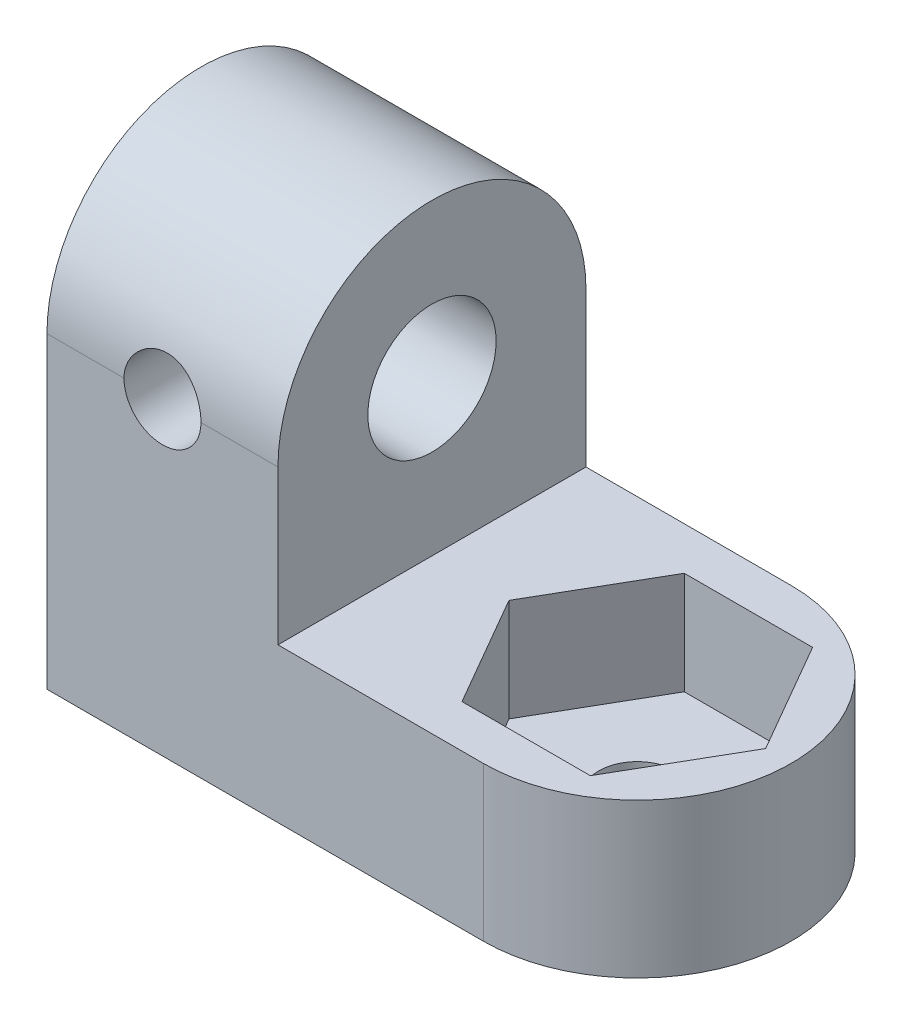
ISO-10303-21;
HEADER;
FILE_DESCRIPTION(('STEP AP214'),'2;1');
FILE_NAME('part.step','',(''),(''),'','','');
FILE_SCHEMA(('AUTOMOTIVE_DESIGN { 1 0 10303 214 1 1 1 1 }'));
ENDSEC;
DATA;
#1=APPLICATION_CONTEXT('core data for automotive mechanical design processes');
#2=APPLICATION_PROTOCOL_DEFINITION('international standard','automotive_design',2000,#1);
#3=PRODUCT_CONTEXT('',#1,'mechanical');
#4=PRODUCT('Part','Part','',(#3));
#5=PRODUCT_RELATED_PRODUCT_CATEGORY('part','',(#4));
#6=PRODUCT_DEFINITION_FORMATION('','',#4);
#7=PRODUCT_DEFINITION_CONTEXT('part definition',#1,'design');
#8=PRODUCT_DEFINITION('design','',#6,#7);
#9=PRODUCT_DEFINITION_SHAPE('','',#8);
#10=(LENGTH_UNIT() NAMED_UNIT(*) SI_UNIT(.MILLI.,.METRE.));
#11=(NAMED_UNIT(*) PLANE_ANGLE_UNIT() SI_UNIT($,.RADIAN.));
#12=(NAMED_UNIT(*) SI_UNIT($,.STERADIAN.) SOLID_ANGLE_UNIT());
#13=UNCERTAINTY_MEASURE_WITH_UNIT(LENGTH_MEASURE(1.E-05),#10,'distance_accuracy_value','');
#14=(GEOMETRIC_REPRESENTATION_CONTEXT(3) GLOBAL_UNCERTAINTY_ASSIGNED_CONTEXT((#13)) GLOBAL_UNIT_ASSIGNED_CONTEXT((#10,
#11,#12)) REPRESENTATION_CONTEXT('',''));
#15=CARTESIAN_POINT('',(0.,0.,0.));
#16=DIRECTION('',(0.,0.,1.));
#17=DIRECTION('',(1.,0.,0.));
#18=AXIS2_PLACEMENT_3D('',#15,#16,#17);
#19=CARTESIAN_POINT('',(-17.,6.,0.));
#20=DIRECTION('',(1.,0.,0.));
#21=DIRECTION('',(0.,0.,-1.));
#22=AXIS2_PLACEMENT_3D('',#19,#20,#21);
#23=PLANE('',#22);
#24=CARTESIAN_POINT('',(-17.,12.,0.));
#25=DIRECTION('',(1.,0.,0.));
#26=DIRECTION('',(0.,0.,-1.));
#27=AXIS2_PLACEMENT_3D('',#24,#25,#26);
#28=CIRCLE('',#27,2.5);
#29=CARTESIAN_POINT('',(-17.,12.,-2.5));
#30=VERTEX_POINT('',#29);
#31=EDGE_CURVE('E398',#30,#30,#28,.T.);
#32=ORIENTED_EDGE('',*,*,#31,.T.);
#33=EDGE_LOOP('',(#32));
#34=FACE_BOUND('',#33,.T.);
#35=DIRECTION('',(0.,-1.,0.));
#36=VECTOR('',#35,1.);
#37=CARTESIAN_POINT('',(-17.,6.,6.));
#38=LINE('',#37,#36);
#39=CARTESIAN_POINT('',(-17.,12.,6.));
#40=VERTEX_POINT('',#39);
#41=CARTESIAN_POINT('',(-17.,0.,6.));
#42=VERTEX_POINT('',#41);
#43=EDGE_CURVE('E273',#40,#42,#38,.T.);
#44=ORIENTED_EDGE('',*,*,#43,.F.);
#45=CARTESIAN_POINT('',(-17.,12.,0.));
#46=DIRECTION('',(-1.,0.,0.));
#47=DIRECTION('',(0.,0.,1.));
#48=AXIS2_PLACEMENT_3D('',#45,#46,#47);
#49=CIRCLE('',#48,6.);
#50=CARTESIAN_POINT('',(-17.,12.,-6.));
#51=VERTEX_POINT('',#50);
#52=EDGE_CURVE('E176',#40,#51,#49,.T.);
#53=ORIENTED_EDGE('',*,*,#52,.T.);
#54=DIRECTION('',(0.,-1.,0.));
#55=VECTOR('',#54,1.);
#56=CARTESIAN_POINT('',(-17.,6.,-6.));
#57=LINE('',#56,#55);
#58=CARTESIAN_POINT('',(-17.,0.,-6.));
#59=VERTEX_POINT('',#58);
#60=EDGE_CURVE('E289',#51,#59,#57,.T.);
#61=ORIENTED_EDGE('',*,*,#60,.T.);
#62=DIRECTION('',(0.,0.,1.));
#63=VECTOR('',#62,1.);
#64=CARTESIAN_POINT('',(-17.,0.,0.));
#65=LINE('',#64,#63);
#66=EDGE_CURVE('E266',#59,#42,#65,.T.);
#67=ORIENTED_EDGE('',*,*,#66,.T.);
#68=EDGE_LOOP('',(#44,#53,#61,#67));
#69=FACE_BOUND('',#68,.T.);
#70=ADVANCED_FACE('F41',(#34,#69),#23,.F.);
#71=CARTESIAN_POINT('',(-8.,18.,6.));
#72=DIRECTION('',(-1.,0.,0.));
#73=DIRECTION('',(0.,0.,1.));
#74=AXIS2_PLACEMENT_3D('',#71,#72,#73);
#75=PLANE('',#74);
#76=CARTESIAN_POINT('',(-8.,12.,0.));
#77=DIRECTION('',(1.,0.,0.));
#78=DIRECTION('',(0.,0.,-1.));
#79=AXIS2_PLACEMENT_3D('',#76,#77,#78);
#80=CIRCLE('',#79,2.5);
#81=CARTESIAN_POINT('',(-8.,12.,-2.5));
#82=VERTEX_POINT('',#81);
#83=EDGE_CURVE('E154',#82,#82,#80,.T.);
#84=ORIENTED_EDGE('',*,*,#83,.F.);
#85=EDGE_LOOP('',(#84));
#86=FACE_BOUND('',#85,.T.);
#87=CARTESIAN_POINT('',(-8.,12.,0.));
#88=DIRECTION('',(-1.,0.,0.));
#89=DIRECTION('',(0.,0.,1.));
#90=AXIS2_PLACEMENT_3D('',#87,#88,#89);
#91=CIRCLE('',#90,6.);
#92=CARTESIAN_POINT('',(-8.,12.,6.));
#93=VERTEX_POINT('',#92);
#94=CARTESIAN_POINT('',(-8.,12.,-6.));
#95=VERTEX_POINT('',#94);
#96=EDGE_CURVE('E169',#93,#95,#91,.T.);
#97=ORIENTED_EDGE('',*,*,#96,.F.);
#98=DIRECTION('',(0.,-1.,0.));
#99=VECTOR('',#98,1.);
#100=CARTESIAN_POINT('',(-8.,18.,6.));
#101=LINE('',#100,#99);
#102=CARTESIAN_POINT('',(-8.,6.,6.));
#103=VERTEX_POINT('',#102);
#104=EDGE_CURVE('E186',#93,#103,#101,.T.);
#105=ORIENTED_EDGE('',*,*,#104,.T.);
#106=DIRECTION('',(0.,0.,-1.));
#107=VECTOR('',#106,1.);
#108=CARTESIAN_POINT('',(-8.,6.,6.));
#109=LINE('',#108,#107);
#110=CARTESIAN_POINT('',(-8.,6.,-6.));
#111=VERTEX_POINT('',#110);
#112=EDGE_CURVE('E174',#103,#111,#109,.T.);
#113=ORIENTED_EDGE('',*,*,#112,.T.);
#114=DIRECTION('',(0.,-1.,0.));
#115=VECTOR('',#114,1.);
#116=CARTESIAN_POINT('',(-8.,18.,-6.));
#117=LINE('',#116,#115);
#118=EDGE_CURVE('E183',#95,#111,#117,.T.);
#119=ORIENTED_EDGE('',*,*,#118,.F.);
#120=EDGE_LOOP('',(#97,#105,#113,#119));
#121=FACE_BOUND('',#120,.T.);
#122=ADVANCED_FACE('F331',(#86,#121),#75,.F.);
#123=CARTESIAN_POINT('',(0.,6.,6.));
#124=DIRECTION('',(0.,0.,1.));
#125=DIRECTION('',(1.,0.,0.));
#126=AXIS2_PLACEMENT_3D('',#123,#124,#125);
#127=PLANE('',#126);
#128=CARTESIAN_POINT('',(-12.5,12.,6.));
#129=DIRECTION('',(0.,0.,1.));
#130=DIRECTION('',(1.,0.,0.));
#131=AXIS2_PLACEMENT_3D('',#128,#129,#130);
#132=CIRCLE('',#131,1.5);
#133=CARTESIAN_POINT('',(-14.,12.,6.));
#134=VERTEX_POINT('',#133);
#135=CARTESIAN_POINT('',(-11.,12.,6.));
#136=VERTEX_POINT('',#135);
#137=EDGE_CURVE('E63',#134,#136,#132,.T.);
#138=ORIENTED_EDGE('',*,*,#137,.F.);
#139=DIRECTION('',(-1.,0.,0.));
#140=VECTOR('',#139,1.);
#141=CARTESIAN_POINT('',(6.,12.,6.));
#142=LINE('',#141,#140);
#143=EDGE_CURVE('E56',#134,#40,#142,.T.);
#144=ORIENTED_EDGE('',*,*,#143,.T.);
#145=ORIENTED_EDGE('',*,*,#43,.T.);
#146=DIRECTION('',(-1.,0.,0.));
#147=VECTOR('',#146,1.);
#148=CARTESIAN_POINT('',(0.,0.,6.));
#149=LINE('',#148,#147);
#150=CARTESIAN_POINT('',(0.,0.,6.));
#151=VERTEX_POINT('',#150);
#152=EDGE_CURVE('E245',#151,#42,#149,.T.);
#153=ORIENTED_EDGE('',*,*,#152,.F.);
#154=DIRECTION('',(0.,-1.,0.));
#155=VECTOR('',#154,1.);
#156=CARTESIAN_POINT('',(0.,6.,6.));
#157=LINE('',#156,#155);
#158=CARTESIAN_POINT('',(0.,6.,6.));
#159=VERTEX_POINT('',#158);
#160=EDGE_CURVE('E296',#159,#151,#157,.T.);
#161=ORIENTED_EDGE('',*,*,#160,.F.);
#162=DIRECTION('',(-1.,0.,0.));
#163=VECTOR('',#162,1.);
#164=CARTESIAN_POINT('',(0.,6.,6.));
#165=LINE('',#164,#163);
#166=EDGE_CURVE('E261',#159,#103,#165,.T.);
#167=ORIENTED_EDGE('',*,*,#166,.T.);
#168=ORIENTED_EDGE('',*,*,#104,.F.);
#169=EDGE_CURVE('E11',#93,#136,#142,.T.);
#170=ORIENTED_EDGE('',*,*,#169,.T.);
#171=EDGE_LOOP('',(#138,#144,#145,#153,#161,#167,#168,#170));
#172=FACE_BOUND('',#171,.T.);
#173=ADVANCED_FACE('F43',(#172),#127,.T.);
#174=CARTESIAN_POINT('',(0.,6.,-6.));
#175=DIRECTION('',(0.,0.,1.));
#176=DIRECTION('',(1.,0.,0.));
#177=AXIS2_PLACEMENT_3D('',#174,#175,#176);
#178=PLANE('',#177);
#179=DIRECTION('',(-1.,0.,0.));
#180=VECTOR('',#179,1.);
#181=CARTESIAN_POINT('',(6.,12.,-6.));
#182=LINE('',#181,#180);
#183=CARTESIAN_POINT('',(-14.,12.,-6.));
#184=VERTEX_POINT('',#183);
#185=EDGE_CURVE('E163',#184,#51,#182,.T.);
#186=ORIENTED_EDGE('',*,*,#185,.F.);
#187=CARTESIAN_POINT('',(-12.5,12.,-6.));
#188=DIRECTION('',(0.,0.,1.));
#189=DIRECTION('',(1.,0.,0.));
#190=AXIS2_PLACEMENT_3D('',#187,#188,#189);
#191=CIRCLE('',#190,1.5);
#192=CARTESIAN_POINT('',(-11.,12.,-6.));
#193=VERTEX_POINT('',#192);
#194=EDGE_CURVE('E70',#184,#193,#191,.T.);
#195=ORIENTED_EDGE('',*,*,#194,.T.);
#196=EDGE_CURVE('E160',#95,#193,#182,.T.);
#197=ORIENTED_EDGE('',*,*,#196,.F.);
#198=ORIENTED_EDGE('',*,*,#118,.T.);
#199=DIRECTION('',(-1.,0.,0.));
#200=VECTOR('',#199,1.);
#201=CARTESIAN_POINT('',(0.,6.,-6.));
#202=LINE('',#201,#200);
#203=CARTESIAN_POINT('',(0.,6.,-6.));
#204=VERTEX_POINT('',#203);
#205=EDGE_CURVE('E269',#204,#111,#202,.T.);
#206=ORIENTED_EDGE('',*,*,#205,.F.);
#207=DIRECTION('',(0.,-1.,0.));
#208=VECTOR('',#207,1.);
#209=CARTESIAN_POINT('',(0.,6.,-6.));
#210=LINE('',#209,#208);
#211=CARTESIAN_POINT('',(0.,0.,-6.));
#212=VERTEX_POINT('',#211);
#213=EDGE_CURVE('E292',#204,#212,#210,.T.);
#214=ORIENTED_EDGE('',*,*,#213,.T.);
#215=DIRECTION('',(-1.,0.,0.));
#216=VECTOR('',#215,1.);
#217=CARTESIAN_POINT('',(0.,0.,-6.));
#218=LINE('',#217,#216);
#219=EDGE_CURVE('E280',#212,#59,#218,.T.);
#220=ORIENTED_EDGE('',*,*,#219,.T.);
#221=ORIENTED_EDGE('',*,*,#60,.F.);
#222=EDGE_LOOP('',(#186,#195,#197,#198,#206,#214,#220,#221));
#223=FACE_BOUND('',#222,.T.);
#224=ADVANCED_FACE('F159',(#223),#178,.F.);
#225=CARTESIAN_POINT('',(0.,6.,0.));
#226=DIRECTION('',(0.,-1.,0.));
#227=DIRECTION('',(0.,0.,-1.));
#228=AXIS2_PLACEMENT_3D('',#225,#226,#227);
#229=CYLINDRICAL_SURFACE('',#228,6.);
#230=CARTESIAN_POINT('',(0.,0.,0.));
#231=DIRECTION('',(0.,1.,0.));
#232=DIRECTION('',(0.,0.,1.));
#233=AXIS2_PLACEMENT_3D('',#230,#231,#232);
#234=CIRCLE('',#233,6.);
#235=EDGE_CURVE('E277',#151,#212,#234,.T.);
#236=ORIENTED_EDGE('',*,*,#235,.T.);
#237=ORIENTED_EDGE('',*,*,#213,.F.);
#238=CARTESIAN_POINT('',(0.,6.,0.));
#239=DIRECTION('',(0.,1.,0.));
#240=DIRECTION('',(0.,0.,1.));
#241=AXIS2_PLACEMENT_3D('',#238,#239,#240);
#242=CIRCLE('',#241,6.);
#243=EDGE_CURVE('E265',#159,#204,#242,.T.);
#244=ORIENTED_EDGE('',*,*,#243,.F.);
#245=ORIENTED_EDGE('',*,*,#160,.T.);
#246=EDGE_LOOP('',(#236,#237,#244,#245));
#247=FACE_BOUND('',#246,.T.);
#248=ADVANCED_FACE('F371',(#247),#229,.T.);
#249=CARTESIAN_POINT('',(0.,6.,0.));
#250=DIRECTION('',(0.,1.,0.));
#251=DIRECTION('',(0.,0.,1.));
#252=AXIS2_PLACEMENT_3D('',#249,#250,#251);
#253=PLANE('',#252);
#254=ORIENTED_EDGE('',*,*,#112,.F.);
#255=ORIENTED_EDGE('',*,*,#166,.F.);
#256=ORIENTED_EDGE('',*,*,#243,.T.);
#257=ORIENTED_EDGE('',*,*,#205,.T.);
#258=EDGE_LOOP('',(#254,#255,#256,#257));
#259=FACE_BOUND('',#258,.T.);
#260=DIRECTION('',(1.,0.,0.));
#261=VECTOR('',#260,1.);
#262=CARTESIAN_POINT('',(-2.5,6.,4.33012701892219));
#263=LINE('',#262,#261);
#264=CARTESIAN_POINT('',(-2.5,6.,4.33012701892219));
#265=VERTEX_POINT('',#264);
#266=CARTESIAN_POINT('',(2.5,6.,4.33012701892219));
#267=VERTEX_POINT('',#266);
#268=EDGE_CURVE('E220',#265,#267,#263,.T.);
#269=ORIENTED_EDGE('',*,*,#268,.F.);
#270=DIRECTION('',(0.5,0.,0.866025403784438));
#271=VECTOR('',#270,1.);
#272=CARTESIAN_POINT('',(-5.,6.,0.));
#273=LINE('',#272,#271);
#274=CARTESIAN_POINT('',(-5.,6.,0.));
#275=VERTEX_POINT('',#274);
#276=EDGE_CURVE('E199',#275,#265,#273,.T.);
#277=ORIENTED_EDGE('',*,*,#276,.F.);
#278=DIRECTION('',(-0.5,0.,0.866025403784439));
#279=VECTOR('',#278,1.);
#280=CARTESIAN_POINT('',(-2.5,6.,-4.33012701892219));
#281=LINE('',#280,#279);
#282=CARTESIAN_POINT('',(-2.5,6.,-4.33012701892219));
#283=VERTEX_POINT('',#282);
#284=EDGE_CURVE('E235',#283,#275,#281,.T.);
#285=ORIENTED_EDGE('',*,*,#284,.F.);
#286=DIRECTION('',(-1.,0.,0.));
#287=VECTOR('',#286,1.);
#288=CARTESIAN_POINT('',(2.5,6.,-4.33012701892219));
#289=LINE('',#288,#287);
#290=CARTESIAN_POINT('',(2.5,6.,-4.33012701892219));
#291=VERTEX_POINT('',#290);
#292=EDGE_CURVE('E231',#291,#283,#289,.T.);
#293=ORIENTED_EDGE('',*,*,#292,.F.);
#294=DIRECTION('',(-0.5,0.,-0.866025403784439));
#295=VECTOR('',#294,1.);
#296=CARTESIAN_POINT('',(5.,6.,0.));
#297=LINE('',#296,#295);
#298=CARTESIAN_POINT('',(5.,6.,0.));
#299=VERTEX_POINT('',#298);
#300=EDGE_CURVE('E227',#299,#291,#297,.T.);
#301=ORIENTED_EDGE('',*,*,#300,.F.);
#302=DIRECTION('',(0.5,0.,-0.866025403784439));
#303=VECTOR('',#302,1.);
#304=CARTESIAN_POINT('',(2.5,6.,4.33012701892219));
#305=LINE('',#304,#303);
#306=EDGE_CURVE('E223',#267,#299,#305,.T.);
#307=ORIENTED_EDGE('',*,*,#306,.F.);
#308=EDGE_LOOP('',(#269,#277,#285,#293,#301,#307));
#309=FACE_BOUND('',#308,.T.);
#310=ADVANCED_FACE('F368',(#259,#309),#253,.T.);
#311=CARTESIAN_POINT('',(0.,0.,0.));
#312=DIRECTION('',(0.,1.,0.));
#313=DIRECTION('',(0.,0.,1.));
#314=AXIS2_PLACEMENT_3D('',#311,#312,#313);
#315=PLANE('',#314);
#316=CARTESIAN_POINT('',(0.,0.,0.));
#317=DIRECTION('',(0.,-1.,0.));
#318=DIRECTION('',(0.,0.,-1.));
#319=AXIS2_PLACEMENT_3D('',#316,#317,#318);
#320=CIRCLE('',#319,1.5);
#321=CARTESIAN_POINT('',(0.,0.,-1.5));
#322=VERTEX_POINT('',#321);
#323=EDGE_CURVE('E189',#322,#322,#320,.T.);
#324=ORIENTED_EDGE('',*,*,#323,.F.);
#325=EDGE_LOOP('',(#324));
#326=FACE_BOUND('',#325,.T.);
#327=ORIENTED_EDGE('',*,*,#152,.T.);
#328=ORIENTED_EDGE('',*,*,#66,.F.);
#329=ORIENTED_EDGE('',*,*,#219,.F.);
#330=ORIENTED_EDGE('',*,*,#235,.F.);
#331=EDGE_LOOP('',(#327,#328,#329,#330));
#332=FACE_BOUND('',#331,.T.);
#333=ADVANCED_FACE('F366',(#326,#332),#315,.F.);
#334=CARTESIAN_POINT('',(-2.5,2.,4.33012701892219));
#335=DIRECTION('',(0.,0.,1.));
#336=DIRECTION('',(1.,0.,0.));
#337=AXIS2_PLACEMENT_3D('',#334,#335,#336);
#338=PLANE('',#337);
#339=ORIENTED_EDGE('',*,*,#268,.T.);
#340=DIRECTION('',(0.,1.,0.));
#341=VECTOR('',#340,1.);
#342=CARTESIAN_POINT('',(2.5,2.,4.33012701892219));
#343=LINE('',#342,#341);
#344=CARTESIAN_POINT('',(2.5,2.,4.33012701892219));
#345=VERTEX_POINT('',#344);
#346=EDGE_CURVE('E219',#345,#267,#343,.T.);
#347=ORIENTED_EDGE('',*,*,#346,.F.);
#348=DIRECTION('',(1.,0.,0.));
#349=VECTOR('',#348,1.);
#350=CARTESIAN_POINT('',(-2.5,2.,4.33012701892219));
#351=LINE('',#350,#349);
#352=CARTESIAN_POINT('',(-2.5,2.,4.33012701892219));
#353=VERTEX_POINT('',#352);
#354=EDGE_CURVE('E194',#353,#345,#351,.T.);
#355=ORIENTED_EDGE('',*,*,#354,.F.);
#356=DIRECTION('',(0.,1.,0.));
#357=VECTOR('',#356,1.);
#358=CARTESIAN_POINT('',(-2.5,2.,4.33012701892219));
#359=LINE('',#358,#357);
#360=EDGE_CURVE('E242',#353,#265,#359,.T.);
#361=ORIENTED_EDGE('',*,*,#360,.T.);
#362=EDGE_LOOP('',(#339,#347,#355,#361));
#363=FACE_BOUND('',#362,.T.);
#364=ADVANCED_FACE('F348',(#363),#338,.F.);
#365=CARTESIAN_POINT('',(-5.,2.,0.));
#366=DIRECTION('',(-0.866025403784438,0.,0.5));
#367=DIRECTION('',(0.5,0.,0.866025403784438));
#368=AXIS2_PLACEMENT_3D('',#365,#366,#367);
#369=PLANE('',#368);
#370=ORIENTED_EDGE('',*,*,#276,.T.);
#371=ORIENTED_EDGE('',*,*,#360,.F.);
#372=DIRECTION('',(0.5,0.,0.866025403784438));
#373=VECTOR('',#372,1.);
#374=CARTESIAN_POINT('',(-5.,2.,0.));
#375=LINE('',#374,#373);
#376=CARTESIAN_POINT('',(-5.,2.,0.));
#377=VERTEX_POINT('',#376);
#378=EDGE_CURVE('E215',#377,#353,#375,.T.);
#379=ORIENTED_EDGE('',*,*,#378,.F.);
#380=DIRECTION('',(0.,1.,0.));
#381=VECTOR('',#380,1.);
#382=CARTESIAN_POINT('',(-5.,2.,0.));
#383=LINE('',#382,#381);
#384=EDGE_CURVE('E246',#377,#275,#383,.T.);
#385=ORIENTED_EDGE('',*,*,#384,.T.);
#386=EDGE_LOOP('',(#370,#371,#379,#385));
#387=FACE_BOUND('',#386,.T.);
#388=ADVANCED_FACE('F344',(#387),#369,.F.);
#389=CARTESIAN_POINT('',(-2.5,2.,-4.33012701892219));
#390=DIRECTION('',(-0.866025403784439,0.,-0.5));
#391=DIRECTION('',(-0.5,0.,0.866025403784439));
#392=AXIS2_PLACEMENT_3D('',#389,#390,#391);
#393=PLANE('',#392);
#394=ORIENTED_EDGE('',*,*,#284,.T.);
#395=ORIENTED_EDGE('',*,*,#384,.F.);
#396=DIRECTION('',(-0.5,0.,0.866025403784439));
#397=VECTOR('',#396,1.);
#398=CARTESIAN_POINT('',(-2.5,2.,-4.33012701892219));
#399=LINE('',#398,#397);
#400=CARTESIAN_POINT('',(-2.5,2.,-4.33012701892219));
#401=VERTEX_POINT('',#400);
#402=EDGE_CURVE('E211',#401,#377,#399,.T.);
#403=ORIENTED_EDGE('',*,*,#402,.F.);
#404=DIRECTION('',(0.,1.,0.));
#405=VECTOR('',#404,1.);
#406=CARTESIAN_POINT('',(-2.5,2.,-4.33012701892219));
#407=LINE('',#406,#405);
#408=EDGE_CURVE('E249',#401,#283,#407,.T.);
#409=ORIENTED_EDGE('',*,*,#408,.T.);
#410=EDGE_LOOP('',(#394,#395,#403,#409));
#411=FACE_BOUND('',#410,.T.);
#412=ADVANCED_FACE('F347',(#411),#393,.F.);
#413=CARTESIAN_POINT('',(2.5,2.,-4.33012701892219));
#414=DIRECTION('',(0.,0.,-1.));
#415=DIRECTION('',(-1.,0.,0.));
#416=AXIS2_PLACEMENT_3D('',#413,#414,#415);
#417=PLANE('',#416);
#418=ORIENTED_EDGE('',*,*,#292,.T.);
#419=ORIENTED_EDGE('',*,*,#408,.F.);
#420=DIRECTION('',(-1.,0.,0.));
#421=VECTOR('',#420,1.);
#422=CARTESIAN_POINT('',(2.5,2.,-4.33012701892219));
#423=LINE('',#422,#421);
#424=CARTESIAN_POINT('',(2.5,2.,-4.33012701892219));
#425=VERTEX_POINT('',#424);
#426=EDGE_CURVE('E207',#425,#401,#423,.T.);
#427=ORIENTED_EDGE('',*,*,#426,.F.);
#428=DIRECTION('',(0.,1.,0.));
#429=VECTOR('',#428,1.);
#430=CARTESIAN_POINT('',(2.5,2.,-4.33012701892219));
#431=LINE('',#430,#429);
#432=EDGE_CURVE('E252',#425,#291,#431,.T.);
#433=ORIENTED_EDGE('',*,*,#432,.T.);
#434=EDGE_LOOP('',(#418,#419,#427,#433));
#435=FACE_BOUND('',#434,.T.);
#436=ADVANCED_FACE('F352',(#435),#417,.F.);
#437=CARTESIAN_POINT('',(5.,2.,0.));
#438=DIRECTION('',(0.866025403784439,0.,-0.5));
#439=DIRECTION('',(-0.5,0.,-0.866025403784439));
#440=AXIS2_PLACEMENT_3D('',#437,#438,#439);
#441=PLANE('',#440);
#442=ORIENTED_EDGE('',*,*,#300,.T.);
#443=ORIENTED_EDGE('',*,*,#432,.F.);
#444=DIRECTION('',(-0.5,0.,-0.866025403784439));
#445=VECTOR('',#444,1.);
#446=CARTESIAN_POINT('',(5.,2.,0.));
#447=LINE('',#446,#445);
#448=CARTESIAN_POINT('',(5.,2.,0.));
#449=VERTEX_POINT('',#448);
#450=EDGE_CURVE('E203',#449,#425,#447,.T.);
#451=ORIENTED_EDGE('',*,*,#450,.F.);
#452=DIRECTION('',(0.,1.,0.));
#453=VECTOR('',#452,1.);
#454=CARTESIAN_POINT('',(5.,2.,0.));
#455=LINE('',#454,#453);
#456=EDGE_CURVE('E255',#449,#299,#455,.T.);
#457=ORIENTED_EDGE('',*,*,#456,.T.);
#458=EDGE_LOOP('',(#442,#443,#451,#457));
#459=FACE_BOUND('',#458,.T.);
#460=ADVANCED_FACE('F356',(#459),#441,.F.);
#461=CARTESIAN_POINT('',(2.5,2.,4.33012701892219));
#462=DIRECTION('',(0.866025403784439,0.,0.5));
#463=DIRECTION('',(0.5,0.,-0.866025403784439));
#464=AXIS2_PLACEMENT_3D('',#461,#462,#463);
#465=PLANE('',#464);
#466=ORIENTED_EDGE('',*,*,#306,.T.);
#467=ORIENTED_EDGE('',*,*,#456,.F.);
#468=DIRECTION('',(0.5,0.,-0.866025403784439));
#469=VECTOR('',#468,1.);
#470=CARTESIAN_POINT('',(2.5,2.,4.33012701892219));
#471=LINE('',#470,#469);
#472=EDGE_CURVE('E198',#345,#449,#471,.T.);
#473=ORIENTED_EDGE('',*,*,#472,.F.);
#474=ORIENTED_EDGE('',*,*,#346,.T.);
#475=EDGE_LOOP('',(#466,#467,#473,#474));
#476=FACE_BOUND('',#475,.T.);
#477=ADVANCED_FACE('F342',(#476),#465,.F.);
#478=CARTESIAN_POINT('',(0.,2.,0.));
#479=DIRECTION('',(0.,1.,0.));
#480=DIRECTION('',(0.,0.,1.));
#481=AXIS2_PLACEMENT_3D('',#478,#479,#480);
#482=PLANE('',#481);
#483=CARTESIAN_POINT('',(0.,2.,0.));
#484=DIRECTION('',(0.,1.,0.));
#485=DIRECTION('',(0.,0.,1.));
#486=AXIS2_PLACEMENT_3D('',#483,#484,#485);
#487=CIRCLE('',#486,1.5);
#488=CARTESIAN_POINT('',(0.,2.,1.5));
#489=VERTEX_POINT('',#488);
#490=EDGE_CURVE('E193',#489,#489,#487,.T.);
#491=ORIENTED_EDGE('',*,*,#490,.F.);
#492=EDGE_LOOP('',(#491));
#493=FACE_BOUND('',#492,.T.);
#494=ORIENTED_EDGE('',*,*,#354,.T.);
#495=ORIENTED_EDGE('',*,*,#472,.T.);
#496=ORIENTED_EDGE('',*,*,#450,.T.);
#497=ORIENTED_EDGE('',*,*,#426,.T.);
#498=ORIENTED_EDGE('',*,*,#402,.T.);
#499=ORIENTED_EDGE('',*,*,#378,.T.);
#500=EDGE_LOOP('',(#494,#495,#496,#497,#498,#499));
#501=FACE_BOUND('',#500,.T.);
#502=ADVANCED_FACE('F338',(#493,#501),#482,.T.);
#503=CARTESIAN_POINT('',(0.,4.,0.));
#504=DIRECTION('',(0.,-1.,0.));
#505=DIRECTION('',(0.,0.,-1.));
#506=AXIS2_PLACEMENT_3D('',#503,#504,#505);
#507=CYLINDRICAL_SURFACE('',#506,1.5);
#508=ORIENTED_EDGE('',*,*,#490,.T.);
#509=EDGE_LOOP('',(#508));
#510=FACE_BOUND('',#509,.T.);
#511=ORIENTED_EDGE('',*,*,#323,.T.);
#512=EDGE_LOOP('',(#511));
#513=FACE_BOUND('',#512,.T.);
#514=ADVANCED_FACE('F330',(#510,#513),#507,.F.);
#515=CARTESIAN_POINT('',(6.,12.,0.));
#516=DIRECTION('',(-1.,0.,0.));
#517=DIRECTION('',(0.,0.,1.));
#518=AXIS2_PLACEMENT_3D('',#515,#516,#517);
#519=CYLINDRICAL_SURFACE('',#518,6.);
#520=CARTESIAN_POINT('',(-14.,12.,-6.));
#521=CARTESIAN_POINT('',(-14.0000004511607,12.0415150274763,-6.00000236670948));
#522=CARTESIAN_POINT('',(-13.9982754003468,12.0830095627937,-5.99956859823992));
#523=CARTESIAN_POINT('',(-13.9913982795259,12.1656896280109,-5.99785398804068));
#524=CARTESIAN_POINT('',(-13.986246742509,12.2068752049616,-5.99657327805296));
#525=CARTESIAN_POINT('',(-13.9657257309551,12.3293581671853,-5.99150773440071));
#526=CARTESIAN_POINT('',(-13.9452895415248,12.4098158990918,-5.98649920763186));
#527=CARTESIAN_POINT('',(-13.8915627680538,12.5660267997017,-5.97375710340751));
#528=CARTESIAN_POINT('',(-13.8582726675891,12.641780145264,-5.96602362846802));
#529=CARTESIAN_POINT('',(-13.7798277723747,12.7866546865119,-5.94865529971126));
#530=CARTESIAN_POINT('',(-13.7346702232868,12.8557743374802,-5.93902000462644));
#531=CARTESIAN_POINT('',(-13.6328010649385,12.9868004986132,-5.91867453115795));
#532=CARTESIAN_POINT('',(-13.5758926449173,13.0485513741729,-5.907947873136));
#533=CARTESIAN_POINT('',(-13.4525527495585,13.1617448236127,-5.8867369773051));
#534=CARTESIAN_POINT('',(-13.3861194956389,13.2131854679412,-5.87625278519763));
#535=CARTESIAN_POINT('',(-13.2444029273885,13.3050278121048,-5.85654750215288));
#536=CARTESIAN_POINT('',(-13.1690028776868,13.3452543092272,-5.84734747156916));
#537=CARTESIAN_POINT('',(-13.0122473956844,13.4123982782097,-5.83149460371209));
#538=CARTESIAN_POINT('',(-12.9308932252628,13.439318560782,-5.824841228568));
#539=CARTESIAN_POINT('',(-12.7662574264459,13.4785546213409,-5.81500482263374));
#540=CARTESIAN_POINT('',(-12.683046990141,13.4911519855815,-5.81175498370963));
#541=CARTESIAN_POINT('',(-12.5156333382078,13.5022618060229,-5.80889361725979));
#542=CARTESIAN_POINT('',(-12.4314302633448,13.5007762358779,-5.80928157991391));
#543=CARTESIAN_POINT('',(-12.2665838254313,13.4839864893189,-5.81359206444804));
#544=CARTESIAN_POINT('',(-12.1859036531416,13.4690182108319,-5.81742866478806));
#545=CARTESIAN_POINT('',(-12.028238257255,13.4262239315782,-5.82806715757521));
#546=CARTESIAN_POINT('',(-11.9512532641241,13.3983971299816,-5.83486923471101));
#547=CARTESIAN_POINT('',(-11.8022611052652,13.3303890973125,-5.85075123316576));
#548=CARTESIAN_POINT('',(-11.7303121393804,13.2900857977919,-5.85985348994134));
#549=CARTESIAN_POINT('',(-11.5940797683319,13.1983549834447,-5.8792973516329));
#550=CARTESIAN_POINT('',(-11.529797526961,13.1469257830551,-5.88963914423136));
#551=CARTESIAN_POINT('',(-11.4088033525451,13.0326702940053,-5.91075759496848));
#552=CARTESIAN_POINT('',(-11.352358376268,12.9695617237899,-5.9215382604816));
#553=CARTESIAN_POINT('',(-11.2507889602635,12.8346270991987,-5.94205742914003));
#554=CARTESIAN_POINT('',(-11.2056674325551,12.7627988094296,-5.95179566383791));
#555=CARTESIAN_POINT('',(-11.1279246990259,12.6120718094805,-5.96918293953861));
#556=CARTESIAN_POINT('',(-11.0953537409779,12.5331462071389,-5.97682354806581));
#557=CARTESIAN_POINT('',(-11.0440577187575,12.3707527154004,-5.98908497728356));
#558=CARTESIAN_POINT('',(-11.0253123752011,12.2872916724319,-5.99371021974566));
#559=CARTESIAN_POINT('',(-11.0091913546125,12.1692581759378,-5.99770766718393));
#560=CARTESIAN_POINT('',(-11.0057439307658,12.135475634411,-5.99856615104559));
#561=CARTESIAN_POINT('',(-11.0011508707346,12.0678007359757,-5.99971200576276));
#562=CARTESIAN_POINT('',(-11.0000014500214,12.0339086518457,-6.00000031561627));
#563=CARTESIAN_POINT('',(-11.,12.,-6.));
#564=B_SPLINE_CURVE_WITH_KNOTS('',3,(#520,#521,#522,#523,#524,#525,#526,#527,#528,#529,#530,
#531,#532,#533,#534,#535,#536,#537,#538,#539,#540,#541,#542,#543,#544,#545,#546,#547,#548,#549,
#550,#551,#552,#553,#554,#555,#556,#557,#558,#559,#560,#561,#562,#563),.UNSPECIFIED.,.F.,.F.,(4,
2,2,2,2,2,2,2,2,2,2,2,2,2,2,2,2,2,2,2,2,4),(0.,0.124466635311029,0.248913914358217,
0.497115275845782,0.745307300681184,0.99355697981515,1.24636202349052,1.49921433534202,
1.75582010695429,2.01237165175757,2.26378715351077,2.5151674211335,2.76045310862793,
3.0057540745976,3.25353522891996,3.50135394816319,3.75621320395632,4.01113793417009,
4.26707293796559,4.52263178612463,4.62447196025068,4.72614427751755),.UNSPECIFIED.);
#565=EDGE_CURVE('E147',#184,#193,#564,.T.);
#566=ORIENTED_EDGE('',*,*,#565,.F.);
#567=ORIENTED_EDGE('',*,*,#185,.T.);
#568=ORIENTED_EDGE('',*,*,#52,.F.);
#569=ORIENTED_EDGE('',*,*,#143,.F.);
#570=CARTESIAN_POINT('',(-11.,12.,6.));
#571=CARTESIAN_POINT('',(-10.9999995488393,12.0415150274763,6.00000236670948));
#572=CARTESIAN_POINT('',(-11.0017245996532,12.0830095627937,5.99956859823992));
#573=CARTESIAN_POINT('',(-11.0086017204741,12.1656896280109,5.99785398804068));
#574=CARTESIAN_POINT('',(-11.013753257491,12.2068752049616,5.99657327805296));
#575=CARTESIAN_POINT('',(-11.0342742690449,12.3293581671853,5.99150773440071));
#576=CARTESIAN_POINT('',(-11.0547104584752,12.4098158990918,5.98649920763186));
#577=CARTESIAN_POINT('',(-11.1084372319462,12.5660267997017,5.97375710340751));
#578=CARTESIAN_POINT('',(-11.1417273324109,12.641780145264,5.96602362846802));
#579=CARTESIAN_POINT('',(-11.2201722276253,12.7866546865119,5.94865529971127));
#580=CARTESIAN_POINT('',(-11.2653297767132,12.8557743374802,5.93902000462644));
#581=CARTESIAN_POINT('',(-11.3671989350615,12.9868004986132,5.91867453115795));
#582=CARTESIAN_POINT('',(-11.4241073550827,13.0485513741729,5.907947873136));
#583=CARTESIAN_POINT('',(-11.5474472504415,13.1617448236127,5.8867369773051));
#584=CARTESIAN_POINT('',(-11.6138805043611,13.2131854679412,5.87625278519763));
#585=CARTESIAN_POINT('',(-11.7555970726115,13.3050278121048,5.85654750215288));
#586=CARTESIAN_POINT('',(-11.8309971223132,13.3452543092272,5.84734747156916));
#587=CARTESIAN_POINT('',(-11.9877526043156,13.4123982782097,5.83149460371209));
#588=CARTESIAN_POINT('',(-12.0691067747372,13.439318560782,5.824841228568));
#589=CARTESIAN_POINT('',(-12.2337425735541,13.4785546213409,5.81500482263375));
#590=CARTESIAN_POINT('',(-12.316953009859,13.4911519855815,5.81175498370963));
#591=CARTESIAN_POINT('',(-12.4843666617922,13.5022618060229,5.8088936172598));
#592=CARTESIAN_POINT('',(-12.5685697366552,13.5007762358779,5.80928157991391));
#593=CARTESIAN_POINT('',(-12.7334161745687,13.4839864893189,5.81359206444804));
#594=CARTESIAN_POINT('',(-12.8140963468585,13.4690182108319,5.81742866478806));
#595=CARTESIAN_POINT('',(-12.971761742745,13.4262239315782,5.82806715757521));
#596=CARTESIAN_POINT('',(-13.0487467358759,13.3983971299816,5.83486923471102));
#597=CARTESIAN_POINT('',(-13.1977388947348,13.3303890973125,5.85075123316576));
#598=CARTESIAN_POINT('',(-13.2696878606196,13.2900857977919,5.85985348994134));
#599=CARTESIAN_POINT('',(-13.4059202316681,13.1983549834447,5.87929735163291));
#600=CARTESIAN_POINT('',(-13.470202473039,13.1469257830551,5.88963914423136));
#601=CARTESIAN_POINT('',(-13.5911966474549,13.0326702940053,5.91075759496849));
#602=CARTESIAN_POINT('',(-13.647641623732,12.9695617237899,5.9215382604816));
#603=CARTESIAN_POINT('',(-13.7492110397365,12.8346270991987,5.94205742914003));
#604=CARTESIAN_POINT('',(-13.7943325674449,12.7627988094296,5.95179566383791));
#605=CARTESIAN_POINT('',(-13.8720753009741,12.6120718094805,5.96918293953861));
#606=CARTESIAN_POINT('',(-13.9046462590221,12.5331462071389,5.97682354806581));
#607=CARTESIAN_POINT('',(-13.9559422812425,12.3707527154004,5.98908497728356));
#608=CARTESIAN_POINT('',(-13.9746876247989,12.2872916724319,5.99371021974567));
#609=CARTESIAN_POINT('',(-13.9908086453875,12.1692581759378,5.99770766718393));
#610=CARTESIAN_POINT('',(-13.9942560692342,12.135475634411,5.99856615104559));
#611=CARTESIAN_POINT('',(-13.9988491292654,12.0678007359757,5.99971200576276));
#612=CARTESIAN_POINT('',(-13.9999985499786,12.0339086518457,6.00000031561627));
#613=CARTESIAN_POINT('',(-14.,12.,6.00000000000001));
#614=B_SPLINE_CURVE_WITH_KNOTS('',3,(#570,#571,#572,#573,#574,#575,#576,#577,#578,#579,#580,
#581,#582,#583,#584,#585,#586,#587,#588,#589,#590,#591,#592,#593,#594,#595,#596,#597,#598,#599,
#600,#601,#602,#603,#604,#605,#606,#607,#608,#609,#610,#611,#612,#613),.UNSPECIFIED.,.F.,.F.,(4,
2,2,2,2,2,2,2,2,2,2,2,2,2,2,2,2,2,2,2,2,4),(0.,0.124466635311029,0.248913914358217,
0.497115275845782,0.745307300681182,0.993556979815149,1.24636202349052,1.49921433534202,
1.75582010695429,2.01237165175757,2.26378715351077,2.5151674211335,2.76045310862793,
3.0057540745976,3.25353522891996,3.50135394816319,3.75621320395632,4.01113793417009,
4.26707293796559,4.52263178612463,4.62447196025068,4.72614427751755),.UNSPECIFIED.);
#615=EDGE_CURVE('E155',#136,#134,#614,.T.);
#616=ORIENTED_EDGE('',*,*,#615,.F.);
#617=ORIENTED_EDGE('',*,*,#169,.F.);
#618=ORIENTED_EDGE('',*,*,#96,.T.);
#619=ORIENTED_EDGE('',*,*,#196,.T.);
#620=EDGE_LOOP('',(#566,#567,#568,#569,#616,#617,#618,#619));
#621=FACE_BOUND('',#620,.T.);
#622=ADVANCED_FACE('F167',(#621),#519,.T.);
#623=CARTESIAN_POINT('',(-17.,12.,0.));
#624=DIRECTION('',(1.,0.,0.));
#625=DIRECTION('',(0.,0.,-1.));
#626=AXIS2_PLACEMENT_3D('',#623,#624,#625);
#627=CYLINDRICAL_SURFACE('',#626,2.5);
#628=CARTESIAN_POINT('',(-14.,12.,-2.5));
#629=CARTESIAN_POINT('',(-13.9999959089901,12.076729833462,-2.49999625789732));
#630=CARTESIAN_POINT('',(-13.9940713290737,12.1535823206442,-2.4964290461501));
#631=CARTESIAN_POINT('',(-13.9706756804847,12.3049755095307,-2.48249903608568));
#632=CARTESIAN_POINT('',(-13.9531761381458,12.3795100345961,-2.47211948032719));
#633=CARTESIAN_POINT('',(-13.9076136388331,12.5237518277908,-2.44561558054488));
#634=CARTESIAN_POINT('',(-13.8796030418368,12.5934810282266,-2.42951973272944));
#635=CARTESIAN_POINT('',(-13.814139666859,12.7270303182147,-2.39295367626407));
#636=CARTESIAN_POINT('',(-13.7766892330313,12.7908518694164,-2.37248455380255));
#637=CARTESIAN_POINT('',(-13.6902251732914,12.9162992789993,-2.32705360719088));
#638=CARTESIAN_POINT('',(-13.6405463046486,12.9773840200814,-2.30186792195985));
#639=CARTESIAN_POINT('',(-13.5325327961717,13.0908827041189,-2.25030439279634));
#640=CARTESIAN_POINT('',(-13.4741870628127,13.1432853494811,-2.2239250515357));
#641=CARTESIAN_POINT('',(-13.3420764895033,13.2444499676297,-2.1691106699591));
#642=CARTESIAN_POINT('',(-13.2672982290187,13.2919776637881,-2.14082017703649));
#643=CARTESIAN_POINT('',(-13.1091534267569,13.373614377649,-2.08938301412124));
#644=CARTESIAN_POINT('',(-13.0258011037524,13.4077451733516,-2.06622802273937));
#645=CARTESIAN_POINT('',(-12.8734035493468,13.4544060171422,-2.0335462966093));
#646=CARTESIAN_POINT('',(-12.8057640013897,13.4701619724683,-2.02207883137591));
#647=CARTESIAN_POINT('',(-12.6681962841696,13.4921617234048,-2.00590308295503));
#648=CARTESIAN_POINT('',(-12.5982710712455,13.4984173455684,-2.00118639643759));
#649=CARTESIAN_POINT('',(-12.4579885057827,13.5010550879601,-1.99920922463856));
#650=CARTESIAN_POINT('',(-12.3876305749068,13.4974178340842,-2.00196337012718));
#651=CARTESIAN_POINT('',(-12.2487212245724,13.4804606047883,-2.01453261443741));
#652=CARTESIAN_POINT('',(-12.1801712041526,13.467133346201,-2.02435302432226));
#653=CARTESIAN_POINT('',(-12.0474697578719,13.4317392188179,-2.04953186944258));
#654=CARTESIAN_POINT('',(-11.9832729460755,13.4097874866609,-2.06481711652537));
#655=CARTESIAN_POINT('',(-11.8593050090719,13.3579506177084,-2.09927051350828));
#656=CARTESIAN_POINT('',(-11.7995355165761,13.328062572597,-2.11844008623465));
#657=CARTESIAN_POINT('',(-11.6750159028772,13.2551798318458,-2.16255327268985));
#658=CARTESIAN_POINT('',(-11.6112219070451,13.2108072439772,-2.18792043372992));
#659=CARTESIAN_POINT('',(-11.491323516333,13.11291092784,-2.23930599764381));
#660=CARTESIAN_POINT('',(-11.4352265660235,13.0593784510058,-2.26532500262149));
#661=CARTESIAN_POINT('',(-11.3243870181782,12.935811834383,-2.31935504958317));
#662=CARTESIAN_POINT('',(-11.270922693984,12.864517682705,-2.34713836268532));
#663=CARTESIAN_POINT('',(-11.1768779528021,12.712276050459,-2.3977242843398));
#664=CARTESIAN_POINT('',(-11.13629064621,12.6313337639436,-2.42052955425515));
#665=CARTESIAN_POINT('',(-11.0720678172041,12.4671975852682,-2.45730392066151));
#666=CARTESIAN_POINT('',(-11.0475246442841,12.3844676241736,-2.47173957439704));
#667=CARTESIAN_POINT('',(-11.0129888025946,12.2150478951446,-2.4921884281355));
#668=CARTESIAN_POINT('',(-11.0029786822464,12.1283630056613,-2.49821172952738));
#669=CARTESIAN_POINT('',(-10.9984921523217,11.9662853856226,-2.5009057037461));
#670=CARTESIAN_POINT('',(-11.0020911449148,11.8909575265813,-2.49873521714286));
#671=CARTESIAN_POINT('',(-11.0204258530719,11.7421705980139,-2.48778712087048));
#672=CARTESIAN_POINT('',(-11.0351613428058,11.6687114906239,-2.47900964518037));
#673=CARTESIAN_POINT('',(-11.0745434328125,11.5274250678424,-2.4559479244219));
#674=CARTESIAN_POINT('',(-11.0989403490735,11.4595042490715,-2.44180275662555));
#675=CARTESIAN_POINT('',(-11.1566773763653,11.3287342509127,-2.40913880862844));
#676=CARTESIAN_POINT('',(-11.1900192513467,11.2658860750361,-2.39061916586511));
#677=CARTESIAN_POINT('',(-11.2685569792087,11.1399937371761,-2.3484549623736));
#678=CARTESIAN_POINT('',(-11.3146238290784,11.0776058495432,-2.3244780273988));
#679=CARTESIAN_POINT('',(-11.4153913934886,10.9609739686899,-2.27474265574731));
#680=CARTESIAN_POINT('',(-11.4701021548525,10.9067395972626,-2.2489821658636));
#681=CARTESIAN_POINT('',(-11.5949103900372,10.8006800326442,-2.19445423909891));
#682=CARTESIAN_POINT('',(-11.6660838854655,10.7500898036909,-2.16573241746291));
#683=CARTESIAN_POINT('',(-11.8172160245682,10.6615476108433,-2.1121618206671));
#684=CARTESIAN_POINT('',(-11.8971652938928,10.6235823323022,-2.0873089799769));
#685=CARTESIAN_POINT('',(-12.0462430223067,10.5685742120422,-2.04984909240519));
#686=CARTESIAN_POINT('',(-12.1139803123586,10.5487837466381,-2.03575659328728));
#687=CARTESIAN_POINT('',(-12.2525320780801,10.5188633609403,-2.01409605743544));
#688=CARTESIAN_POINT('',(-12.3233421443278,10.5087200470237,-2.00651897642721));
#689=CARTESIAN_POINT('',(-12.466376947597,10.4986586958337,-1.99900446616267));
#690=CARTESIAN_POINT('',(-12.538605990687,10.4987791089213,-1.99909576445937));
#691=CARTESIAN_POINT('',(-12.6818944356095,10.5093352704067,-2.0069771789285));
#692=CARTESIAN_POINT('',(-12.7529531800806,10.5197766278424,-2.0147714813882));
#693=CARTESIAN_POINT('',(-12.8884884175722,10.5495982585109,-2.0363318524298));
#694=CARTESIAN_POINT('',(-12.9531170943069,10.5685236315465,-2.0497921180558));
#695=CARTESIAN_POINT('',(-13.0783372544742,10.6143675792301,-2.08105501960151));
#696=CARTESIAN_POINT('',(-13.1389272069606,10.6412891641152,-2.09885929040482));
#697=CARTESIAN_POINT('',(-13.2643198572208,10.7071075444427,-2.14012990550917));
#698=CARTESIAN_POINT('',(-13.3283411038543,10.7472083232425,-2.16404587582639));
#699=CARTESIAN_POINT('',(-13.4493800726173,10.8362430161092,-2.21320127030768));
#700=CARTESIAN_POINT('',(-13.5063919621526,10.885184203922,-2.23844177205021));
#701=CARTESIAN_POINT('',(-13.6213509491317,10.9999022257427,-2.29225690291476));
#702=CARTESIAN_POINT('',(-13.6779310748962,11.0671231806861,-2.32070308663658));
#703=CARTESIAN_POINT('',(-13.7790978558633,11.2115375655544,-2.37365428872367));
#704=CARTESIAN_POINT('',(-13.8236802119848,11.2887345554985,-2.39815789310936));
#705=CARTESIAN_POINT('',(-13.8977858075737,11.4488747691986,-2.43985578654394));
#706=CARTESIAN_POINT('',(-13.9277280649268,11.5315699130428,-2.45725077479787));
#707=CARTESIAN_POINT('',(-13.972724695211,11.7020266938812,-2.48366273001246));
#708=CARTESIAN_POINT('',(-13.987835167857,11.7897679003514,-2.49271125871485));
#709=CARTESIAN_POINT('',(-13.9966974547087,11.8984419030825,-2.49802001168187));
#710=CARTESIAN_POINT('',(-13.9979344173061,11.9187237409717,-2.49876114656362));
#711=CARTESIAN_POINT('',(-13.9995862463709,11.9593341793129,-2.49975164517367));
#712=CARTESIAN_POINT('',(-14.0000010843209,11.9796627813624,-2.50000099184316));
#713=CARTESIAN_POINT('',(-14.,12.,-2.5));
#714=B_SPLINE_CURVE_WITH_KNOTS('',3,(#628,#629,#630,#631,#632,#633,#634,#635,#636,#637,#638,
#639,#640,#641,#642,#643,#644,#645,#646,#647,#648,#649,#650,#651,#652,#653,#654,#655,#656,#657,
#658,#659,#660,#661,#662,#663,#664,#665,#666,#667,#668,#669,#670,#671,#672,#673,#674,#675,#676,
#677,#678,#679,#680,#681,#682,#683,#684,#685,#686,#687,#688,#689,#690,#691,#692,#693,#694,#695,
#696,#697,#698,#699,#700,#701,#702,#703,#704,#705,#706,#707,#708,#709,#710,#711,#712,#713),
.UNSPECIFIED.,.T.,.F.,(4,2,2,2,2,2,2,2,2,2,2,2,2,2,2,2,2,2,2,2,2,2,2,2,2,2,2,2,2,2,2,2,2,2,2,2,
2,2,2,2,2,2,4),(0.,0.23010223754865,0.460772627520013,0.690308884600013,0.919788197992276,
1.16681590732473,1.41416257934801,1.69183813189807,1.96906040692092,2.17933829855634,
2.38935420916578,2.59978170870726,2.81036753273872,3.01823267593207,3.22617409809869,
3.47046995225163,3.71500044803674,3.99360957884691,4.27206939275324,4.5329679069656,
4.79355286918236,5.01875602722426,5.24395461863455,5.46367785689772,5.68344445659025,
5.92601365818362,6.16886690081836,6.4433676242801,6.71757792616456,6.93257787314693,
7.14727888733319,7.36278425777433,7.57840681155725,7.78364098331142,7.98895251523035,
8.22578610052286,8.46281544370208,8.73854311775519,9.01436946031985,9.28175654462677,
9.54812832184449,9.60911473335177,9.67010326027641),.UNSPECIFIED.);
#715=CARTESIAN_POINT('',(-14.,12.,-2.5));
#716=VERTEX_POINT('',#715);
#717=EDGE_CURVE('E45',#716,#716,#714,.T.);
#718=ORIENTED_EDGE('',*,*,#717,.T.);
#719=EDGE_LOOP('',(#718));
#720=FACE_BOUND('',#719,.T.);
#721=CARTESIAN_POINT('',(-11.,12.,2.5));
#722=CARTESIAN_POINT('',(-11.0000040910099,12.076729833462,2.49999625789732));
#723=CARTESIAN_POINT('',(-11.0059286709263,12.1535823206442,2.4964290461501));
#724=CARTESIAN_POINT('',(-11.0293243195153,12.3049755095307,2.48249903608568));
#725=CARTESIAN_POINT('',(-11.0468238618542,12.3795100345961,2.47211948032719));
#726=CARTESIAN_POINT('',(-11.0923863611669,12.5237518277908,2.44561558054488));
#727=CARTESIAN_POINT('',(-11.1203969581632,12.5934810282266,2.42951973272944));
#728=CARTESIAN_POINT('',(-11.185860333141,12.7270303182147,2.39295367626408));
#729=CARTESIAN_POINT('',(-11.2233107669687,12.7908518694164,2.37248455380255));
#730=CARTESIAN_POINT('',(-11.3097748267086,12.9162992789993,2.32705360719088));
#731=CARTESIAN_POINT('',(-11.3594536953514,12.9773840200814,2.30186792195985));
#732=CARTESIAN_POINT('',(-11.4674672038283,13.0908827041189,2.25030439279634));
#733=CARTESIAN_POINT('',(-11.5258129371873,13.1432853494811,2.22392505153571));
#734=CARTESIAN_POINT('',(-11.6579235104967,13.2444499676297,2.1691106699591));
#735=CARTESIAN_POINT('',(-11.7327017709813,13.2919776637881,2.14082017703649));
#736=CARTESIAN_POINT('',(-11.8908465732431,13.373614377649,2.08938301412124));
#737=CARTESIAN_POINT('',(-11.9741988962476,13.4077451733516,2.06622802273938));
#738=CARTESIAN_POINT('',(-12.1265964506532,13.4544060171422,2.0335462966093));
#739=CARTESIAN_POINT('',(-12.1942359986103,13.4701619724683,2.02207883137591));
#740=CARTESIAN_POINT('',(-12.3318037158304,13.4921617234048,2.00590308295503));
#741=CARTESIAN_POINT('',(-12.4017289287545,13.4984173455684,2.0011863964376));
#742=CARTESIAN_POINT('',(-12.5420114942173,13.5010550879601,1.99920922463856));
#743=CARTESIAN_POINT('',(-12.6123694250932,13.4974178340842,2.00196337012718));
#744=CARTESIAN_POINT('',(-12.7512787754276,13.4804606047883,2.01453261443741));
#745=CARTESIAN_POINT('',(-12.8198287958474,13.467133346201,2.02435302432226));
#746=CARTESIAN_POINT('',(-12.9525302421281,13.4317392188179,2.04953186944258));
#747=CARTESIAN_POINT('',(-13.0167270539245,13.4097874866609,2.06481711652537));
#748=CARTESIAN_POINT('',(-13.1406949909281,13.3579506177084,2.09927051350828));
#749=CARTESIAN_POINT('',(-13.2004644834239,13.328062572597,2.11844008623465));
#750=CARTESIAN_POINT('',(-13.3249840971228,13.2551798318458,2.16255327268985));
#751=CARTESIAN_POINT('',(-13.3887780929549,13.2108072439772,2.18792043372992));
#752=CARTESIAN_POINT('',(-13.508676483667,13.11291092784,2.23930599764381));
#753=CARTESIAN_POINT('',(-13.5647734339765,13.0593784510058,2.26532500262149));
#754=CARTESIAN_POINT('',(-13.6756129818218,12.935811834383,2.31935504958317));
#755=CARTESIAN_POINT('',(-13.729077306016,12.864517682705,2.34713836268532));
#756=CARTESIAN_POINT('',(-13.8231220471979,12.712276050459,2.39772428433981));
#757=CARTESIAN_POINT('',(-13.86370935379,12.6313337639436,2.42052955425515));
#758=CARTESIAN_POINT('',(-13.9279321827959,12.4671975852682,2.45730392066151));
#759=CARTESIAN_POINT('',(-13.9524753557159,12.3844676241736,2.47173957439704));
#760=CARTESIAN_POINT('',(-13.9870111974054,12.2150478951446,2.49218842813551));
#761=CARTESIAN_POINT('',(-13.9970213177536,12.1283630056613,2.49821172952738));
#762=CARTESIAN_POINT('',(-14.0015078476783,11.9662853856226,2.5009057037461));
#763=CARTESIAN_POINT('',(-13.9979088550852,11.8909575265813,2.49873521714286));
#764=CARTESIAN_POINT('',(-13.9795741469281,11.7421705980139,2.48778712087049));
#765=CARTESIAN_POINT('',(-13.9648386571942,11.6687114906239,2.47900964518038));
#766=CARTESIAN_POINT('',(-13.9254565671875,11.5274250678424,2.45594792442191));
#767=CARTESIAN_POINT('',(-13.9010596509265,11.4595042490715,2.44180275662555));
#768=CARTESIAN_POINT('',(-13.8433226236347,11.3287342509127,2.40913880862845));
#769=CARTESIAN_POINT('',(-13.8099807486533,11.2658860750361,2.39061916586511));
#770=CARTESIAN_POINT('',(-13.7314430207913,11.1399937371761,2.3484549623736));
#771=CARTESIAN_POINT('',(-13.6853761709216,11.0776058495432,2.3244780273988));
#772=CARTESIAN_POINT('',(-13.5846086065114,10.9609739686899,2.27474265574732));
#773=CARTESIAN_POINT('',(-13.5298978451475,10.9067395972626,2.24898216586361));
#774=CARTESIAN_POINT('',(-13.4050896099629,10.8006800326442,2.19445423909891));
#775=CARTESIAN_POINT('',(-13.3339161145345,10.7500898036909,2.16573241746291));
#776=CARTESIAN_POINT('',(-13.1827839754318,10.6615476108433,2.1121618206671));
#777=CARTESIAN_POINT('',(-13.1028347061072,10.6235823323022,2.0873089799769));
#778=CARTESIAN_POINT('',(-12.9537569776933,10.5685742120422,2.04984909240519));
#779=CARTESIAN_POINT('',(-12.8860196876414,10.5487837466381,2.03575659328729));
#780=CARTESIAN_POINT('',(-12.7474679219199,10.5188633609403,2.01409605743544));
#781=CARTESIAN_POINT('',(-12.6766578556722,10.5087200470237,2.00651897642721));
#782=CARTESIAN_POINT('',(-12.533623052403,10.4986586958337,1.99900446616268));
#783=CARTESIAN_POINT('',(-12.461394009313,10.4987791089213,1.99909576445937));
#784=CARTESIAN_POINT('',(-12.3181055643905,10.5093352704067,2.0069771789285));
#785=CARTESIAN_POINT('',(-12.2470468199194,10.5197766278424,2.0147714813882));
#786=CARTESIAN_POINT('',(-12.1115115824278,10.5495982585109,2.0363318524298));
#787=CARTESIAN_POINT('',(-12.0468829056931,10.5685236315465,2.04979211805581));
#788=CARTESIAN_POINT('',(-11.9216627455258,10.6143675792301,2.08105501960152));
#789=CARTESIAN_POINT('',(-11.8610727930394,10.6412891641152,2.09885929040482));
#790=CARTESIAN_POINT('',(-11.7356801427792,10.7071075444427,2.14012990550917));
#791=CARTESIAN_POINT('',(-11.6716588961457,10.7472083232425,2.1640458758264));
#792=CARTESIAN_POINT('',(-11.5506199273827,10.8362430161092,2.21320127030768));
#793=CARTESIAN_POINT('',(-11.4936080378474,10.885184203922,2.23844177205021));
#794=CARTESIAN_POINT('',(-11.3786490508683,10.9999022257427,2.29225690291477));
#795=CARTESIAN_POINT('',(-11.3220689251038,11.0671231806861,2.32070308663658));
#796=CARTESIAN_POINT('',(-11.2209021441367,11.2115375655544,2.37365428872367));
#797=CARTESIAN_POINT('',(-11.1763197880152,11.2887345554985,2.39815789310936));
#798=CARTESIAN_POINT('',(-11.1022141924263,11.4488747691986,2.43985578654394));
#799=CARTESIAN_POINT('',(-11.0722719350732,11.5315699130428,2.45725077479787));
#800=CARTESIAN_POINT('',(-11.027275304789,11.7020266938812,2.48366273001246));
#801=CARTESIAN_POINT('',(-11.012164832143,11.7897679003514,2.49271125871485));
#802=CARTESIAN_POINT('',(-11.0033025452913,11.8984419030825,2.49802001168187));
#803=CARTESIAN_POINT('',(-11.0020655826939,11.9187237409717,2.49876114656362));
#804=CARTESIAN_POINT('',(-11.0004137536291,11.9593341793129,2.49975164517367));
#805=CARTESIAN_POINT('',(-10.9999989156791,11.9796627813624,2.50000099184316));
#806=CARTESIAN_POINT('',(-11.,12.,2.5));
#807=B_SPLINE_CURVE_WITH_KNOTS('',3,(#721,#722,#723,#724,#725,#726,#727,#728,#729,#730,#731,
#732,#733,#734,#735,#736,#737,#738,#739,#740,#741,#742,#743,#744,#745,#746,#747,#748,#749,#750,
#751,#752,#753,#754,#755,#756,#757,#758,#759,#760,#761,#762,#763,#764,#765,#766,#767,#768,#769,
#770,#771,#772,#773,#774,#775,#776,#777,#778,#779,#780,#781,#782,#783,#784,#785,#786,#787,#788,
#789,#790,#791,#792,#793,#794,#795,#796,#797,#798,#799,#800,#801,#802,#803,#804,#805,#806),
.UNSPECIFIED.,.T.,.F.,(4,2,2,2,2,2,2,2,2,2,2,2,2,2,2,2,2,2,2,2,2,2,2,2,2,2,2,2,2,2,2,2,2,2,2,2,
2,2,2,2,2,2,4),(0.,0.23010223754865,0.460772627520013,0.690308884600013,0.919788197992276,
1.16681590732473,1.41416257934801,1.69183813189807,1.96906040692092,2.17933829855634,
2.38935420916578,2.59978170870726,2.81036753273872,3.01823267593207,3.22617409809869,
3.47046995225163,3.71500044803674,3.99360957884691,4.27206939275324,4.5329679069656,
4.79355286918236,5.01875602722426,5.24395461863455,5.46367785689772,5.68344445659025,
5.92601365818362,6.16886690081836,6.4433676242801,6.71757792616456,6.93257787314693,
7.14727888733319,7.36278425777433,7.57840681155725,7.78364098331142,7.98895251523035,
8.22578610052286,8.46281544370208,8.73854311775519,9.01436946031985,9.28175654462677,
9.54812832184449,9.60911473335177,9.67010326027641),.UNSPECIFIED.);
#808=CARTESIAN_POINT('',(-11.,12.,2.5));
#809=VERTEX_POINT('',#808);
#810=EDGE_CURVE('E165',#809,#809,#807,.T.);
#811=ORIENTED_EDGE('',*,*,#810,.T.);
#812=EDGE_LOOP('',(#811));
#813=FACE_BOUND('',#812,.T.);
#814=ORIENTED_EDGE('',*,*,#31,.F.);
#815=EDGE_LOOP('',(#814));
#816=FACE_BOUND('',#815,.T.);
#817=ORIENTED_EDGE('',*,*,#83,.T.);
#818=EDGE_LOOP('',(#817));
#819=FACE_BOUND('',#818,.T.);
#820=ADVANCED_FACE('F306',(#720,#813,#816,#819),#627,.F.);
#821=CARTESIAN_POINT('',(-12.5,12.,-6.));
#822=DIRECTION('',(0.,0.,1.));
#823=DIRECTION('',(1.,0.,0.));
#824=AXIS2_PLACEMENT_3D('',#821,#822,#823);
#825=CYLINDRICAL_SURFACE('',#824,1.5);
#826=ORIENTED_EDGE('',*,*,#615,.T.);
#827=ORIENTED_EDGE('',*,*,#137,.T.);
#828=EDGE_LOOP('',(#826,#827));
#829=FACE_BOUND('',#828,.T.);
#830=ORIENTED_EDGE('',*,*,#810,.F.);
#831=EDGE_LOOP('',(#830));
#832=FACE_BOUND('',#831,.T.);
#833=ADVANCED_FACE('F311',(#829,#832),#825,.F.);
#834=ORIENTED_EDGE('',*,*,#565,.T.);
#835=ORIENTED_EDGE('',*,*,#194,.F.);
#836=EDGE_LOOP('',(#834,#835));
#837=FACE_BOUND('',#836,.T.);
#838=ORIENTED_EDGE('',*,*,#717,.F.);
#839=EDGE_LOOP('',(#838));
#840=FACE_BOUND('',#839,.T.);
#841=ADVANCED_FACE('F148',(#837,#840),#825,.F.);
#842=CLOSED_SHELL('',(#70,#122,#173,#224,#248,#310,#333,#364,#388,#412,#436,#460,#477,#502,#514,
#622,#820,#833,#841));
#843=MANIFOLD_SOLID_BREP('B2',#842);
#844=ADVANCED_BREP_SHAPE_REPRESENTATION('',(#18,#843),#14);
#845=SHAPE_DEFINITION_REPRESENTATION(#9,#844);
ENDSEC;
END-ISO-10303-21;
